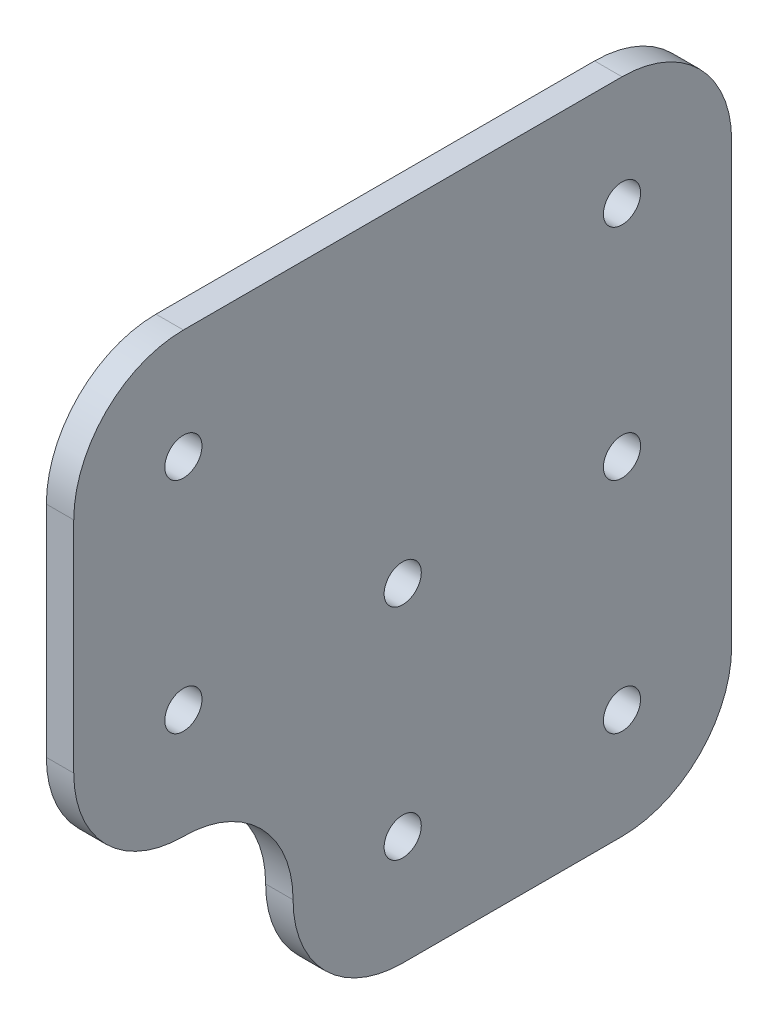
ISO-10303-21;
HEADER;
FILE_DESCRIPTION(('STEP AP214'),'2;1');
FILE_NAME('part.step','',(''),(''),'','','');
FILE_SCHEMA(('AUTOMOTIVE_DESIGN { 1 0 10303 214 1 1 1 1 }'));
ENDSEC;
DATA;
#1=APPLICATION_CONTEXT('core data for automotive mechanical design processes');
#2=APPLICATION_PROTOCOL_DEFINITION('international standard','automotive_design',2000,#1);
#3=PRODUCT_CONTEXT('',#1,'mechanical');
#4=PRODUCT('Part','Part','',(#3));
#5=PRODUCT_RELATED_PRODUCT_CATEGORY('part','',(#4));
#6=PRODUCT_DEFINITION_FORMATION('','',#4);
#7=PRODUCT_DEFINITION_CONTEXT('part definition',#1,'design');
#8=PRODUCT_DEFINITION('design','',#6,#7);
#9=PRODUCT_DEFINITION_SHAPE('','',#8);
#10=(LENGTH_UNIT() NAMED_UNIT(*) SI_UNIT(.MILLI.,.METRE.));
#11=(NAMED_UNIT(*) PLANE_ANGLE_UNIT() SI_UNIT($,.RADIAN.));
#12=(NAMED_UNIT(*) SI_UNIT($,.STERADIAN.) SOLID_ANGLE_UNIT());
#13=UNCERTAINTY_MEASURE_WITH_UNIT(LENGTH_MEASURE(1.E-05),#10,'distance_accuracy_value','');
#14=(GEOMETRIC_REPRESENTATION_CONTEXT(3) GLOBAL_UNCERTAINTY_ASSIGNED_CONTEXT((#13)) GLOBAL_UNIT_ASSIGNED_CONTEXT((#10,
#11,#12)) REPRESENTATION_CONTEXT('',''));
#15=CARTESIAN_POINT('',(0.,0.,0.));
#16=DIRECTION('',(0.,0.,1.));
#17=DIRECTION('',(1.,0.,0.));
#18=AXIS2_PLACEMENT_3D('',#15,#16,#17);
#19=CARTESIAN_POINT('',(1.5875,-38.1,-38.1));
#20=DIRECTION('',(0.,0.,1.));
#21=DIRECTION('',(1.,0.,0.));
#22=AXIS2_PLACEMENT_3D('',#19,#20,#21);
#23=PLANE('',#22);
#24=DIRECTION('',(0.,1.,0.));
#25=VECTOR('',#24,1.);
#26=CARTESIAN_POINT('',(-1.5875,-38.1,-38.1));
#27=LINE('',#26,#25);
#28=CARTESIAN_POINT('',(-1.5875,-25.4,-38.1));
#29=VERTEX_POINT('',#28);
#30=CARTESIAN_POINT('',(-1.5875,25.4,-38.1));
#31=VERTEX_POINT('',#30);
#32=EDGE_CURVE('E134',#29,#31,#27,.T.);
#33=ORIENTED_EDGE('',*,*,#32,.T.);
#34=DIRECTION('',(1.,0.,0.));
#35=VECTOR('',#34,1.);
#36=CARTESIAN_POINT('',(-1.5875,25.4,-38.1));
#37=LINE('',#36,#35);
#38=CARTESIAN_POINT('',(1.5875,25.4,-38.1));
#39=VERTEX_POINT('',#38);
#40=EDGE_CURVE('E199',#31,#39,#37,.T.);
#41=ORIENTED_EDGE('',*,*,#40,.T.);
#42=DIRECTION('',(0.,1.,0.));
#43=VECTOR('',#42,1.);
#44=CARTESIAN_POINT('',(1.5875,-38.1,-38.1));
#45=LINE('',#44,#43);
#46=CARTESIAN_POINT('',(1.5875,-25.4,-38.1));
#47=VERTEX_POINT('',#46);
#48=EDGE_CURVE('E133',#47,#39,#45,.T.);
#49=ORIENTED_EDGE('',*,*,#48,.F.);
#50=DIRECTION('',(1.,0.,0.));
#51=VECTOR('',#50,1.);
#52=CARTESIAN_POINT('',(-1.5875,-25.4,-38.1));
#53=LINE('',#52,#51);
#54=EDGE_CURVE('E197',#29,#47,#53,.T.);
#55=ORIENTED_EDGE('',*,*,#54,.F.);
#56=EDGE_LOOP('',(#33,#41,#49,#55));
#57=FACE_BOUND('',#56,.T.);
#58=ADVANCED_FACE('F33',(#57),#23,.F.);
#59=CARTESIAN_POINT('',(1.5875,38.1,38.1));
#60=DIRECTION('',(0.,-1.,0.));
#61=DIRECTION('',(0.,0.,-1.));
#62=AXIS2_PLACEMENT_3D('',#59,#60,#61);
#63=PLANE('',#62);
#64=DIRECTION('',(0.,0.,1.));
#65=VECTOR('',#64,1.);
#66=CARTESIAN_POINT('',(-1.5875,38.1,38.1));
#67=LINE('',#66,#65);
#68=CARTESIAN_POINT('',(-1.5875,38.1,-25.4));
#69=VERTEX_POINT('',#68);
#70=CARTESIAN_POINT('',(-1.5875,38.1,25.4));
#71=VERTEX_POINT('',#70);
#72=EDGE_CURVE('E131',#69,#71,#67,.T.);
#73=ORIENTED_EDGE('',*,*,#72,.T.);
#74=DIRECTION('',(1.,0.,0.));
#75=VECTOR('',#74,1.);
#76=CARTESIAN_POINT('',(-1.5875,38.1,25.4));
#77=LINE('',#76,#75);
#78=CARTESIAN_POINT('',(1.5875,38.1,25.4));
#79=VERTEX_POINT('',#78);
#80=EDGE_CURVE('E49',#71,#79,#77,.T.);
#81=ORIENTED_EDGE('',*,*,#80,.T.);
#82=DIRECTION('',(0.,0.,1.));
#83=VECTOR('',#82,1.);
#84=CARTESIAN_POINT('',(1.5875,38.1,38.1));
#85=LINE('',#84,#83);
#86=CARTESIAN_POINT('',(1.5875,38.1,-25.4));
#87=VERTEX_POINT('',#86);
#88=EDGE_CURVE('E141',#87,#79,#85,.T.);
#89=ORIENTED_EDGE('',*,*,#88,.F.);
#90=DIRECTION('',(1.,0.,0.));
#91=VECTOR('',#90,1.);
#92=CARTESIAN_POINT('',(-1.5875,38.1,-25.4));
#93=LINE('',#92,#91);
#94=EDGE_CURVE('E202',#69,#87,#93,.T.);
#95=ORIENTED_EDGE('',*,*,#94,.F.);
#96=EDGE_LOOP('',(#73,#81,#89,#95));
#97=FACE_BOUND('',#96,.T.);
#98=ADVANCED_FACE('F240',(#97),#63,.F.);
#99=CARTESIAN_POINT('',(1.5875,-38.1,38.1));
#100=DIRECTION('',(0.,0.,-1.));
#101=DIRECTION('',(-1.,0.,0.));
#102=AXIS2_PLACEMENT_3D('',#99,#100,#101);
#103=PLANE('',#102);
#104=DIRECTION('',(1.,0.,0.));
#105=VECTOR('',#104,1.);
#106=CARTESIAN_POINT('',(-1.5875,25.4,38.1));
#107=LINE('',#106,#105);
#108=CARTESIAN_POINT('',(-1.5875,25.4,38.1));
#109=VERTEX_POINT('',#108);
#110=CARTESIAN_POINT('',(1.5875,25.4,38.1));
#111=VERTEX_POINT('',#110);
#112=EDGE_CURVE('E112',#109,#111,#107,.T.);
#113=ORIENTED_EDGE('',*,*,#112,.F.);
#114=DIRECTION('',(0.,-1.,0.));
#115=VECTOR('',#114,1.);
#116=CARTESIAN_POINT('',(-1.5875,-38.1,38.1));
#117=LINE('',#116,#115);
#118=CARTESIAN_POINT('',(-1.5875,0.,38.1));
#119=VERTEX_POINT('',#118);
#120=EDGE_CURVE('E125',#109,#119,#117,.T.);
#121=ORIENTED_EDGE('',*,*,#120,.T.);
#122=DIRECTION('',(1.,0.,0.));
#123=VECTOR('',#122,1.);
#124=CARTESIAN_POINT('',(-1.5875,0.,38.1));
#125=LINE('',#124,#123);
#126=CARTESIAN_POINT('',(1.5875,0.,38.1));
#127=VERTEX_POINT('',#126);
#128=EDGE_CURVE('E57',#119,#127,#125,.T.);
#129=ORIENTED_EDGE('',*,*,#128,.T.);
#130=DIRECTION('',(0.,-1.,0.));
#131=VECTOR('',#130,1.);
#132=CARTESIAN_POINT('',(1.5875,-38.1,38.1));
#133=LINE('',#132,#131);
#134=EDGE_CURVE('E41',#111,#127,#133,.T.);
#135=ORIENTED_EDGE('',*,*,#134,.F.);
#136=EDGE_LOOP('',(#113,#121,#129,#135));
#137=FACE_BOUND('',#136,.T.);
#138=ADVANCED_FACE('F124',(#137),#103,.F.);
#139=CARTESIAN_POINT('',(1.5875,-38.1,38.1));
#140=DIRECTION('',(0.,1.,0.));
#141=DIRECTION('',(0.,0.,1.));
#142=AXIS2_PLACEMENT_3D('',#139,#140,#141);
#143=PLANE('',#142);
#144=DIRECTION('',(0.,0.,-1.));
#145=VECTOR('',#144,1.);
#146=CARTESIAN_POINT('',(-1.5875,-38.1,38.1));
#147=LINE('',#146,#145);
#148=CARTESIAN_POINT('',(-1.5875,-38.1,0.));
#149=VERTEX_POINT('',#148);
#150=CARTESIAN_POINT('',(-1.5875,-38.1,-25.4));
#151=VERTEX_POINT('',#150);
#152=EDGE_CURVE('E36',#149,#151,#147,.T.);
#153=ORIENTED_EDGE('',*,*,#152,.T.);
#154=DIRECTION('',(1.,0.,0.));
#155=VECTOR('',#154,1.);
#156=CARTESIAN_POINT('',(-1.5875,-38.1,-25.4));
#157=LINE('',#156,#155);
#158=CARTESIAN_POINT('',(1.5875,-38.1,-25.4));
#159=VERTEX_POINT('',#158);
#160=EDGE_CURVE('E194',#151,#159,#157,.T.);
#161=ORIENTED_EDGE('',*,*,#160,.T.);
#162=DIRECTION('',(0.,0.,-1.));
#163=VECTOR('',#162,1.);
#164=CARTESIAN_POINT('',(1.5875,-38.1,38.1));
#165=LINE('',#164,#163);
#166=CARTESIAN_POINT('',(1.5875,-38.1,0.));
#167=VERTEX_POINT('',#166);
#168=EDGE_CURVE('E11',#167,#159,#165,.T.);
#169=ORIENTED_EDGE('',*,*,#168,.F.);
#170=DIRECTION('',(1.,0.,0.));
#171=VECTOR('',#170,1.);
#172=CARTESIAN_POINT('',(-1.5875,-38.1,0.));
#173=LINE('',#172,#171);
#174=EDGE_CURVE('E192',#149,#167,#173,.T.);
#175=ORIENTED_EDGE('',*,*,#174,.F.);
#176=EDGE_LOOP('',(#153,#161,#169,#175));
#177=FACE_BOUND('',#176,.T.);
#178=ADVANCED_FACE('F254',(#177),#143,.F.);
#179=CARTESIAN_POINT('',(1.5875,0.,0.));
#180=DIRECTION('',(-1.,0.,0.));
#181=DIRECTION('',(0.,0.,1.));
#182=AXIS2_PLACEMENT_3D('',#179,#180,#181);
#183=PLANE('',#182);
#184=CARTESIAN_POINT('',(1.5875,25.4,25.4));
#185=DIRECTION('',(1.,0.,0.));
#186=DIRECTION('',(0.,0.,-1.));
#187=AXIS2_PLACEMENT_3D('',#184,#185,#186);
#188=CIRCLE('',#187,2.15264999999999);
#189=CARTESIAN_POINT('',(1.5875,25.4,23.24735));
#190=VERTEX_POINT('',#189);
#191=EDGE_CURVE('E184',#190,#190,#188,.T.);
#192=ORIENTED_EDGE('',*,*,#191,.F.);
#193=EDGE_LOOP('',(#192));
#194=FACE_BOUND('',#193,.T.);
#195=CARTESIAN_POINT('',(1.5875,0.,25.4));
#196=DIRECTION('',(1.,0.,0.));
#197=DIRECTION('',(0.,0.,-1.));
#198=AXIS2_PLACEMENT_3D('',#195,#196,#197);
#199=CIRCLE('',#198,2.15264999999999);
#200=CARTESIAN_POINT('',(1.5875,0.,23.24735));
#201=VERTEX_POINT('',#200);
#202=EDGE_CURVE('E178',#201,#201,#199,.T.);
#203=ORIENTED_EDGE('',*,*,#202,.F.);
#204=EDGE_LOOP('',(#203));
#205=FACE_BOUND('',#204,.T.);
#206=CARTESIAN_POINT('',(1.5875,25.4,-25.4));
#207=DIRECTION('',(1.,0.,0.));
#208=DIRECTION('',(0.,0.,-1.));
#209=AXIS2_PLACEMENT_3D('',#206,#207,#208);
#210=CIRCLE('',#209,2.15264999999999);
#211=CARTESIAN_POINT('',(1.5875,25.4,-27.55265));
#212=VERTEX_POINT('',#211);
#213=EDGE_CURVE('E172',#212,#212,#210,.T.);
#214=ORIENTED_EDGE('',*,*,#213,.F.);
#215=EDGE_LOOP('',(#214));
#216=FACE_BOUND('',#215,.T.);
#217=CARTESIAN_POINT('',(1.5875,0.,0.));
#218=DIRECTION('',(1.,0.,0.));
#219=DIRECTION('',(0.,0.,-1.));
#220=AXIS2_PLACEMENT_3D('',#217,#218,#219);
#221=CIRCLE('',#220,2.15264999999999);
#222=CARTESIAN_POINT('',(1.5875,0.,-2.15264999999998));
#223=VERTEX_POINT('',#222);
#224=EDGE_CURVE('E166',#223,#223,#221,.T.);
#225=ORIENTED_EDGE('',*,*,#224,.F.);
#226=EDGE_LOOP('',(#225));
#227=FACE_BOUND('',#226,.T.);
#228=CARTESIAN_POINT('',(1.5875,0.,-25.4));
#229=DIRECTION('',(1.,0.,0.));
#230=DIRECTION('',(0.,0.,-1.));
#231=AXIS2_PLACEMENT_3D('',#228,#229,#230);
#232=CIRCLE('',#231,2.15264999999999);
#233=CARTESIAN_POINT('',(1.5875,0.,-27.55265));
#234=VERTEX_POINT('',#233);
#235=EDGE_CURVE('E160',#234,#234,#232,.T.);
#236=ORIENTED_EDGE('',*,*,#235,.F.);
#237=EDGE_LOOP('',(#236));
#238=FACE_BOUND('',#237,.T.);
#239=CARTESIAN_POINT('',(1.5875,-25.4,0.));
#240=DIRECTION('',(1.,0.,0.));
#241=DIRECTION('',(0.,0.,-1.));
#242=AXIS2_PLACEMENT_3D('',#239,#240,#241);
#243=CIRCLE('',#242,2.15264999999999);
#244=CARTESIAN_POINT('',(1.5875,-25.4,-2.15264999999998));
#245=VERTEX_POINT('',#244);
#246=EDGE_CURVE('E154',#245,#245,#243,.T.);
#247=ORIENTED_EDGE('',*,*,#246,.F.);
#248=EDGE_LOOP('',(#247));
#249=FACE_BOUND('',#248,.T.);
#250=CARTESIAN_POINT('',(1.5875,-25.4,-25.4));
#251=DIRECTION('',(1.,0.,0.));
#252=DIRECTION('',(0.,0.,-1.));
#253=AXIS2_PLACEMENT_3D('',#250,#251,#252);
#254=CIRCLE('',#253,2.15264999999999);
#255=CARTESIAN_POINT('',(1.5875,-25.4,-27.55265));
#256=VERTEX_POINT('',#255);
#257=EDGE_CURVE('E148',#256,#256,#254,.T.);
#258=ORIENTED_EDGE('',*,*,#257,.F.);
#259=EDGE_LOOP('',(#258));
#260=FACE_BOUND('',#259,.T.);
#261=CARTESIAN_POINT('',(1.5875,25.4,25.4));
#262=DIRECTION('',(1.,0.,0.));
#263=DIRECTION('',(0.,0.,-1.));
#264=AXIS2_PLACEMENT_3D('',#261,#262,#263);
#265=CIRCLE('',#264,12.7);
#266=EDGE_CURVE('E219',#79,#111,#265,.T.);
#267=ORIENTED_EDGE('',*,*,#266,.T.);
#268=ORIENTED_EDGE('',*,*,#134,.T.);
#269=CARTESIAN_POINT('',(1.5875,0.,25.4));
#270=DIRECTION('',(1.,0.,0.));
#271=DIRECTION('',(0.,0.,-1.));
#272=AXIS2_PLACEMENT_3D('',#269,#270,#271);
#273=CIRCLE('',#272,12.7);
#274=CARTESIAN_POINT('',(1.5875,-12.7,25.4));
#275=VERTEX_POINT('',#274);
#276=EDGE_CURVE('E216',#127,#275,#273,.T.);
#277=ORIENTED_EDGE('',*,*,#276,.T.);
#278=CARTESIAN_POINT('',(1.5875,-25.4,25.4));
#279=DIRECTION('',(-1.,0.,0.));
#280=DIRECTION('',(0.,0.,-1.));
#281=AXIS2_PLACEMENT_3D('',#278,#279,#280);
#282=CIRCLE('',#281,12.7);
#283=CARTESIAN_POINT('',(1.5875,-25.4,12.7));
#284=VERTEX_POINT('',#283);
#285=EDGE_CURVE('E213',#275,#284,#282,.T.);
#286=ORIENTED_EDGE('',*,*,#285,.T.);
#287=CARTESIAN_POINT('',(1.5875,-25.4,0.));
#288=DIRECTION('',(1.,0.,0.));
#289=DIRECTION('',(0.,0.,1.));
#290=AXIS2_PLACEMENT_3D('',#287,#288,#289);
#291=CIRCLE('',#290,12.7);
#292=EDGE_CURVE('E210',#284,#167,#291,.T.);
#293=ORIENTED_EDGE('',*,*,#292,.T.);
#294=ORIENTED_EDGE('',*,*,#168,.T.);
#295=CARTESIAN_POINT('',(1.5875,-25.4,-25.4));
#296=DIRECTION('',(1.,0.,0.));
#297=DIRECTION('',(0.,0.,1.));
#298=AXIS2_PLACEMENT_3D('',#295,#296,#297);
#299=CIRCLE('',#298,12.7);
#300=EDGE_CURVE('E207',#159,#47,#299,.T.);
#301=ORIENTED_EDGE('',*,*,#300,.T.);
#302=ORIENTED_EDGE('',*,*,#48,.T.);
#303=CARTESIAN_POINT('',(1.5875,25.4,-25.4));
#304=DIRECTION('',(1.,0.,0.));
#305=DIRECTION('',(0.,0.,1.));
#306=AXIS2_PLACEMENT_3D('',#303,#304,#305);
#307=CIRCLE('',#306,12.7);
#308=EDGE_CURVE('E119',#39,#87,#307,.T.);
#309=ORIENTED_EDGE('',*,*,#308,.T.);
#310=ORIENTED_EDGE('',*,*,#88,.T.);
#311=EDGE_LOOP('',(#267,#268,#277,#286,#293,#294,#301,#302,#309,#310));
#312=FACE_BOUND('',#311,.T.);
#313=ADVANCED_FACE('F237',(#194,#205,#216,#227,#238,#249,#260,#312),#183,.F.);
#314=CARTESIAN_POINT('',(-1.5875,0.,0.));
#315=DIRECTION('',(-1.,0.,0.));
#316=DIRECTION('',(0.,0.,1.));
#317=AXIS2_PLACEMENT_3D('',#314,#315,#316);
#318=PLANE('',#317);
#319=CARTESIAN_POINT('',(-1.5875,25.4,25.4));
#320=DIRECTION('',(1.,0.,0.));
#321=DIRECTION('',(0.,0.,-1.));
#322=AXIS2_PLACEMENT_3D('',#319,#320,#321);
#323=CIRCLE('',#322,2.15265);
#324=CARTESIAN_POINT('',(-1.5875,25.4,23.24735));
#325=VERTEX_POINT('',#324);
#326=EDGE_CURVE('E181',#325,#325,#323,.T.);
#327=ORIENTED_EDGE('',*,*,#326,.T.);
#328=EDGE_LOOP('',(#327));
#329=FACE_BOUND('',#328,.T.);
#330=CARTESIAN_POINT('',(-1.5875,0.,25.4));
#331=DIRECTION('',(1.,0.,0.));
#332=DIRECTION('',(0.,0.,-1.));
#333=AXIS2_PLACEMENT_3D('',#330,#331,#332);
#334=CIRCLE('',#333,2.15265);
#335=CARTESIAN_POINT('',(-1.5875,0.,23.24735));
#336=VERTEX_POINT('',#335);
#337=EDGE_CURVE('E175',#336,#336,#334,.T.);
#338=ORIENTED_EDGE('',*,*,#337,.T.);
#339=EDGE_LOOP('',(#338));
#340=FACE_BOUND('',#339,.T.);
#341=CARTESIAN_POINT('',(-1.5875,25.4,-25.4));
#342=DIRECTION('',(1.,0.,0.));
#343=DIRECTION('',(0.,0.,-1.));
#344=AXIS2_PLACEMENT_3D('',#341,#342,#343);
#345=CIRCLE('',#344,2.15265);
#346=CARTESIAN_POINT('',(-1.5875,25.4,-27.55265));
#347=VERTEX_POINT('',#346);
#348=EDGE_CURVE('E169',#347,#347,#345,.T.);
#349=ORIENTED_EDGE('',*,*,#348,.T.);
#350=EDGE_LOOP('',(#349));
#351=FACE_BOUND('',#350,.T.);
#352=CARTESIAN_POINT('',(-1.5875,0.,0.));
#353=DIRECTION('',(1.,0.,0.));
#354=DIRECTION('',(0.,0.,-1.));
#355=AXIS2_PLACEMENT_3D('',#352,#353,#354);
#356=CIRCLE('',#355,2.15265);
#357=CARTESIAN_POINT('',(-1.5875,0.,-2.15264999999999));
#358=VERTEX_POINT('',#357);
#359=EDGE_CURVE('E163',#358,#358,#356,.T.);
#360=ORIENTED_EDGE('',*,*,#359,.T.);
#361=EDGE_LOOP('',(#360));
#362=FACE_BOUND('',#361,.T.);
#363=CARTESIAN_POINT('',(-1.5875,0.,-25.4));
#364=DIRECTION('',(1.,0.,0.));
#365=DIRECTION('',(0.,0.,-1.));
#366=AXIS2_PLACEMENT_3D('',#363,#364,#365);
#367=CIRCLE('',#366,2.15265);
#368=CARTESIAN_POINT('',(-1.5875,0.,-27.55265));
#369=VERTEX_POINT('',#368);
#370=EDGE_CURVE('E157',#369,#369,#367,.T.);
#371=ORIENTED_EDGE('',*,*,#370,.T.);
#372=EDGE_LOOP('',(#371));
#373=FACE_BOUND('',#372,.T.);
#374=CARTESIAN_POINT('',(-1.5875,-25.4,0.));
#375=DIRECTION('',(1.,0.,0.));
#376=DIRECTION('',(0.,0.,-1.));
#377=AXIS2_PLACEMENT_3D('',#374,#375,#376);
#378=CIRCLE('',#377,2.15265);
#379=CARTESIAN_POINT('',(-1.5875,-25.4,-2.15264999999999));
#380=VERTEX_POINT('',#379);
#381=EDGE_CURVE('E151',#380,#380,#378,.T.);
#382=ORIENTED_EDGE('',*,*,#381,.T.);
#383=EDGE_LOOP('',(#382));
#384=FACE_BOUND('',#383,.T.);
#385=CARTESIAN_POINT('',(-1.5875,-25.4,-25.4));
#386=DIRECTION('',(1.,0.,0.));
#387=DIRECTION('',(0.,0.,-1.));
#388=AXIS2_PLACEMENT_3D('',#385,#386,#387);
#389=CIRCLE('',#388,2.15265);
#390=CARTESIAN_POINT('',(-1.5875,-25.4,-27.55265));
#391=VERTEX_POINT('',#390);
#392=EDGE_CURVE('E138',#391,#391,#389,.T.);
#393=ORIENTED_EDGE('',*,*,#392,.T.);
#394=EDGE_LOOP('',(#393));
#395=FACE_BOUND('',#394,.T.);
#396=ORIENTED_EDGE('',*,*,#120,.F.);
#397=CARTESIAN_POINT('',(-1.5875,25.4,25.4));
#398=DIRECTION('',(1.,0.,0.));
#399=DIRECTION('',(0.,0.,-1.));
#400=AXIS2_PLACEMENT_3D('',#397,#398,#399);
#401=CIRCLE('',#400,12.7);
#402=EDGE_CURVE('E109',#71,#109,#401,.T.);
#403=ORIENTED_EDGE('',*,*,#402,.F.);
#404=ORIENTED_EDGE('',*,*,#72,.F.);
#405=CARTESIAN_POINT('',(-1.5875,25.4,-25.4));
#406=DIRECTION('',(1.,0.,0.));
#407=DIRECTION('',(0.,0.,1.));
#408=AXIS2_PLACEMENT_3D('',#405,#406,#407);
#409=CIRCLE('',#408,12.7);
#410=EDGE_CURVE('E127',#31,#69,#409,.T.);
#411=ORIENTED_EDGE('',*,*,#410,.F.);
#412=ORIENTED_EDGE('',*,*,#32,.F.);
#413=CARTESIAN_POINT('',(-1.5875,-25.4,-25.4));
#414=DIRECTION('',(1.,0.,0.));
#415=DIRECTION('',(0.,0.,1.));
#416=AXIS2_PLACEMENT_3D('',#413,#414,#415);
#417=CIRCLE('',#416,12.7);
#418=EDGE_CURVE('E222',#151,#29,#417,.T.);
#419=ORIENTED_EDGE('',*,*,#418,.F.);
#420=ORIENTED_EDGE('',*,*,#152,.F.);
#421=CARTESIAN_POINT('',(-1.5875,-25.4,0.));
#422=DIRECTION('',(1.,0.,0.));
#423=DIRECTION('',(0.,0.,1.));
#424=AXIS2_PLACEMENT_3D('',#421,#422,#423);
#425=CIRCLE('',#424,12.7);
#426=CARTESIAN_POINT('',(-1.5875,-25.4,12.7));
#427=VERTEX_POINT('',#426);
#428=EDGE_CURVE('E224',#427,#149,#425,.T.);
#429=ORIENTED_EDGE('',*,*,#428,.F.);
#430=CARTESIAN_POINT('',(-1.5875,-25.4,25.4));
#431=DIRECTION('',(-1.,0.,0.));
#432=DIRECTION('',(0.,0.,-1.));
#433=AXIS2_PLACEMENT_3D('',#430,#431,#432);
#434=CIRCLE('',#433,12.7);
#435=CARTESIAN_POINT('',(-1.5875,-12.7,25.4));
#436=VERTEX_POINT('',#435);
#437=EDGE_CURVE('E226',#436,#427,#434,.T.);
#438=ORIENTED_EDGE('',*,*,#437,.F.);
#439=CARTESIAN_POINT('',(-1.5875,0.,25.4));
#440=DIRECTION('',(1.,0.,0.));
#441=DIRECTION('',(0.,0.,-1.));
#442=AXIS2_PLACEMENT_3D('',#439,#440,#441);
#443=CIRCLE('',#442,12.7);
#444=EDGE_CURVE('E118',#119,#436,#443,.T.);
#445=ORIENTED_EDGE('',*,*,#444,.F.);
#446=EDGE_LOOP('',(#396,#403,#404,#411,#412,#419,#420,#429,#438,#445));
#447=FACE_BOUND('',#446,.T.);
#448=ADVANCED_FACE('F129',(#329,#340,#351,#362,#373,#384,#395,#447),#318,.T.);
#449=CARTESIAN_POINT('',(1.5875,-25.4,-25.4));
#450=DIRECTION('',(1.,0.,0.));
#451=DIRECTION('',(0.,0.,-1.));
#452=AXIS2_PLACEMENT_3D('',#449,#450,#451);
#453=CYLINDRICAL_SURFACE('',#452,2.15264999999999);
#454=ORIENTED_EDGE('',*,*,#392,.F.);
#455=EDGE_LOOP('',(#454));
#456=FACE_BOUND('',#455,.T.);
#457=ORIENTED_EDGE('',*,*,#257,.T.);
#458=EDGE_LOOP('',(#457));
#459=FACE_BOUND('',#458,.T.);
#460=ADVANCED_FACE('F279',(#456,#459),#453,.F.);
#461=CARTESIAN_POINT('',(1.5875,-25.4,0.));
#462=DIRECTION('',(1.,0.,0.));
#463=DIRECTION('',(0.,0.,-1.));
#464=AXIS2_PLACEMENT_3D('',#461,#462,#463);
#465=CYLINDRICAL_SURFACE('',#464,2.15264999999999);
#466=ORIENTED_EDGE('',*,*,#381,.F.);
#467=EDGE_LOOP('',(#466));
#468=FACE_BOUND('',#467,.T.);
#469=ORIENTED_EDGE('',*,*,#246,.T.);
#470=EDGE_LOOP('',(#469));
#471=FACE_BOUND('',#470,.T.);
#472=ADVANCED_FACE('F286',(#468,#471),#465,.F.);
#473=CARTESIAN_POINT('',(1.5875,0.,-25.4));
#474=DIRECTION('',(1.,0.,0.));
#475=DIRECTION('',(0.,0.,-1.));
#476=AXIS2_PLACEMENT_3D('',#473,#474,#475);
#477=CYLINDRICAL_SURFACE('',#476,2.15264999999999);
#478=ORIENTED_EDGE('',*,*,#370,.F.);
#479=EDGE_LOOP('',(#478));
#480=FACE_BOUND('',#479,.T.);
#481=ORIENTED_EDGE('',*,*,#235,.T.);
#482=EDGE_LOOP('',(#481));
#483=FACE_BOUND('',#482,.T.);
#484=ADVANCED_FACE('F290',(#480,#483),#477,.F.);
#485=CARTESIAN_POINT('',(1.5875,0.,0.));
#486=DIRECTION('',(1.,0.,0.));
#487=DIRECTION('',(0.,0.,-1.));
#488=AXIS2_PLACEMENT_3D('',#485,#486,#487);
#489=CYLINDRICAL_SURFACE('',#488,2.15264999999999);
#490=ORIENTED_EDGE('',*,*,#359,.F.);
#491=EDGE_LOOP('',(#490));
#492=FACE_BOUND('',#491,.T.);
#493=ORIENTED_EDGE('',*,*,#224,.T.);
#494=EDGE_LOOP('',(#493));
#495=FACE_BOUND('',#494,.T.);
#496=ADVANCED_FACE('F294',(#492,#495),#489,.F.);
#497=CARTESIAN_POINT('',(1.5875,25.4,-25.4));
#498=DIRECTION('',(1.,0.,0.));
#499=DIRECTION('',(0.,0.,-1.));
#500=AXIS2_PLACEMENT_3D('',#497,#498,#499);
#501=CYLINDRICAL_SURFACE('',#500,2.15264999999999);
#502=ORIENTED_EDGE('',*,*,#348,.F.);
#503=EDGE_LOOP('',(#502));
#504=FACE_BOUND('',#503,.T.);
#505=ORIENTED_EDGE('',*,*,#213,.T.);
#506=EDGE_LOOP('',(#505));
#507=FACE_BOUND('',#506,.T.);
#508=ADVANCED_FACE('F298',(#504,#507),#501,.F.);
#509=CARTESIAN_POINT('',(1.5875,0.,25.4));
#510=DIRECTION('',(1.,0.,0.));
#511=DIRECTION('',(0.,0.,-1.));
#512=AXIS2_PLACEMENT_3D('',#509,#510,#511);
#513=CYLINDRICAL_SURFACE('',#512,2.15264999999999);
#514=ORIENTED_EDGE('',*,*,#337,.F.);
#515=EDGE_LOOP('',(#514));
#516=FACE_BOUND('',#515,.T.);
#517=ORIENTED_EDGE('',*,*,#202,.T.);
#518=EDGE_LOOP('',(#517));
#519=FACE_BOUND('',#518,.T.);
#520=ADVANCED_FACE('F302',(#516,#519),#513,.F.);
#521=CARTESIAN_POINT('',(1.5875,25.4,25.4));
#522=DIRECTION('',(1.,0.,0.));
#523=DIRECTION('',(0.,0.,-1.));
#524=AXIS2_PLACEMENT_3D('',#521,#522,#523);
#525=CYLINDRICAL_SURFACE('',#524,2.15264999999999);
#526=ORIENTED_EDGE('',*,*,#326,.F.);
#527=EDGE_LOOP('',(#526));
#528=FACE_BOUND('',#527,.T.);
#529=ORIENTED_EDGE('',*,*,#191,.T.);
#530=EDGE_LOOP('',(#529));
#531=FACE_BOUND('',#530,.T.);
#532=ADVANCED_FACE('F306',(#528,#531),#525,.F.);
#533=CARTESIAN_POINT('',(-1.5875,0.,25.4));
#534=DIRECTION('',(1.,0.,0.));
#535=DIRECTION('',(0.,0.,-1.));
#536=AXIS2_PLACEMENT_3D('',#533,#534,#535);
#537=CYLINDRICAL_SURFACE('',#536,12.7);
#538=ORIENTED_EDGE('',*,*,#276,.F.);
#539=ORIENTED_EDGE('',*,*,#128,.F.);
#540=ORIENTED_EDGE('',*,*,#444,.T.);
#541=DIRECTION('',(1.,0.,0.));
#542=VECTOR('',#541,1.);
#543=CARTESIAN_POINT('',(-1.5875,-12.7,25.4));
#544=LINE('',#543,#542);
#545=EDGE_CURVE('E188',#436,#275,#544,.T.);
#546=ORIENTED_EDGE('',*,*,#545,.T.);
#547=EDGE_LOOP('',(#538,#539,#540,#546));
#548=FACE_BOUND('',#547,.T.);
#549=ADVANCED_FACE('F229',(#548),#537,.T.);
#550=CARTESIAN_POINT('',(-1.5875,-25.4,25.4));
#551=DIRECTION('',(1.,0.,0.));
#552=DIRECTION('',(0.,0.,-1.));
#553=AXIS2_PLACEMENT_3D('',#550,#551,#552);
#554=CYLINDRICAL_SURFACE('',#553,12.7);
#555=ORIENTED_EDGE('',*,*,#285,.F.);
#556=ORIENTED_EDGE('',*,*,#545,.F.);
#557=ORIENTED_EDGE('',*,*,#437,.T.);
#558=DIRECTION('',(1.,0.,0.));
#559=VECTOR('',#558,1.);
#560=CARTESIAN_POINT('',(-1.5875,-25.4,12.7));
#561=LINE('',#560,#559);
#562=EDGE_CURVE('E190',#427,#284,#561,.T.);
#563=ORIENTED_EDGE('',*,*,#562,.T.);
#564=EDGE_LOOP('',(#555,#556,#557,#563));
#565=FACE_BOUND('',#564,.T.);
#566=ADVANCED_FACE('F234',(#565),#554,.F.);
#567=CARTESIAN_POINT('',(-1.5875,-25.4,0.));
#568=DIRECTION('',(1.,0.,0.));
#569=DIRECTION('',(0.,0.,-1.));
#570=AXIS2_PLACEMENT_3D('',#567,#568,#569);
#571=CYLINDRICAL_SURFACE('',#570,12.7);
#572=ORIENTED_EDGE('',*,*,#292,.F.);
#573=ORIENTED_EDGE('',*,*,#562,.F.);
#574=ORIENTED_EDGE('',*,*,#428,.T.);
#575=ORIENTED_EDGE('',*,*,#174,.T.);
#576=EDGE_LOOP('',(#572,#573,#574,#575));
#577=FACE_BOUND('',#576,.T.);
#578=ADVANCED_FACE('F256',(#577),#571,.T.);
#579=CARTESIAN_POINT('',(-1.5875,-25.4,-25.4));
#580=DIRECTION('',(1.,0.,0.));
#581=DIRECTION('',(0.,0.,-1.));
#582=AXIS2_PLACEMENT_3D('',#579,#580,#581);
#583=CYLINDRICAL_SURFACE('',#582,12.7);
#584=ORIENTED_EDGE('',*,*,#300,.F.);
#585=ORIENTED_EDGE('',*,*,#160,.F.);
#586=ORIENTED_EDGE('',*,*,#418,.T.);
#587=ORIENTED_EDGE('',*,*,#54,.T.);
#588=EDGE_LOOP('',(#584,#585,#586,#587));
#589=FACE_BOUND('',#588,.T.);
#590=ADVANCED_FACE('F250',(#589),#583,.T.);
#591=CARTESIAN_POINT('',(-1.5875,25.4,-25.4));
#592=DIRECTION('',(1.,0.,0.));
#593=DIRECTION('',(0.,0.,-1.));
#594=AXIS2_PLACEMENT_3D('',#591,#592,#593);
#595=CYLINDRICAL_SURFACE('',#594,12.7);
#596=ORIENTED_EDGE('',*,*,#308,.F.);
#597=ORIENTED_EDGE('',*,*,#40,.F.);
#598=ORIENTED_EDGE('',*,*,#410,.T.);
#599=ORIENTED_EDGE('',*,*,#94,.T.);
#600=EDGE_LOOP('',(#596,#597,#598,#599));
#601=FACE_BOUND('',#600,.T.);
#602=ADVANCED_FACE('F263',(#601),#595,.T.);
#603=CARTESIAN_POINT('',(-1.5875,25.4,25.4));
#604=DIRECTION('',(1.,0.,0.));
#605=DIRECTION('',(0.,0.,-1.));
#606=AXIS2_PLACEMENT_3D('',#603,#604,#605);
#607=CYLINDRICAL_SURFACE('',#606,12.7);
#608=ORIENTED_EDGE('',*,*,#266,.F.);
#609=ORIENTED_EDGE('',*,*,#80,.F.);
#610=ORIENTED_EDGE('',*,*,#402,.T.);
#611=ORIENTED_EDGE('',*,*,#112,.T.);
#612=EDGE_LOOP('',(#608,#609,#610,#611));
#613=FACE_BOUND('',#612,.T.);
#614=ADVANCED_FACE('F111',(#613),#607,.T.);
#615=CLOSED_SHELL('',(#58,#98,#138,#178,#313,#448,#460,#472,#484,#496,#508,#520,#532,#549,#566,
#578,#590,#602,#614));
#616=MANIFOLD_SOLID_BREP('B2',#615);
#617=ADVANCED_BREP_SHAPE_REPRESENTATION('',(#18,#616),#14);
#618=SHAPE_DEFINITION_REPRESENTATION(#9,#617);
ENDSEC;
END-ISO-10303-21;
